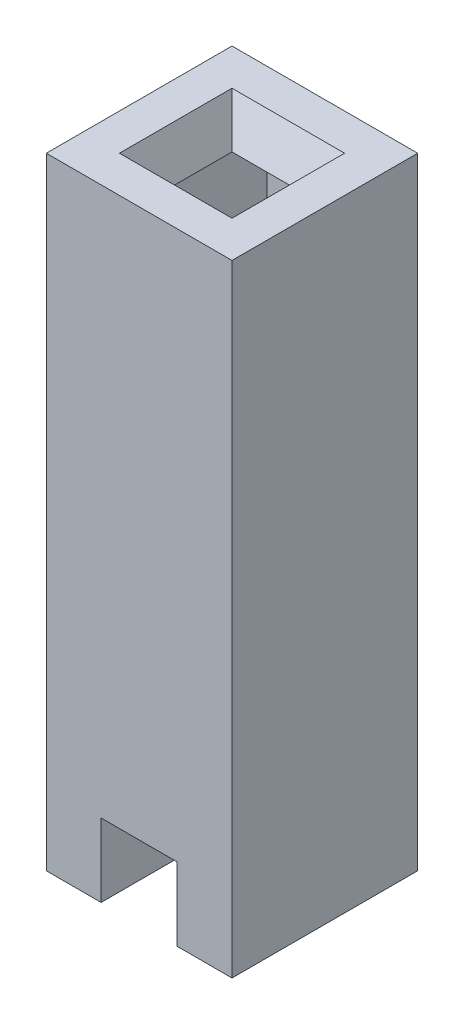
ISO-10303-21;
HEADER;
FILE_DESCRIPTION(('STEP AP214'),'2;1');
FILE_NAME('part.step','',(''),(''),'','','');
FILE_SCHEMA(('AUTOMOTIVE_DESIGN { 1 0 10303 214 1 1 1 1 }'));
ENDSEC;
DATA;
#1=APPLICATION_CONTEXT('core data for automotive mechanical design processes');
#2=APPLICATION_PROTOCOL_DEFINITION('international standard','automotive_design',2000,#1);
#3=PRODUCT_CONTEXT('',#1,'mechanical');
#4=PRODUCT('Part','Part','',(#3));
#5=PRODUCT_RELATED_PRODUCT_CATEGORY('part','',(#4));
#6=PRODUCT_DEFINITION_FORMATION('','',#4);
#7=PRODUCT_DEFINITION_CONTEXT('part definition',#1,'design');
#8=PRODUCT_DEFINITION('design','',#6,#7);
#9=PRODUCT_DEFINITION_SHAPE('','',#8);
#10=(LENGTH_UNIT() NAMED_UNIT(*) SI_UNIT(.MILLI.,.METRE.));
#11=(NAMED_UNIT(*) PLANE_ANGLE_UNIT() SI_UNIT($,.RADIAN.));
#12=(NAMED_UNIT(*) SI_UNIT($,.STERADIAN.) SOLID_ANGLE_UNIT());
#13=UNCERTAINTY_MEASURE_WITH_UNIT(LENGTH_MEASURE(1.E-05),#10,'distance_accuracy_value','');
#14=(GEOMETRIC_REPRESENTATION_CONTEXT(3) GLOBAL_UNCERTAINTY_ASSIGNED_CONTEXT((#13)) GLOBAL_UNIT_ASSIGNED_CONTEXT((#10,
#11,#12)) REPRESENTATION_CONTEXT('',''));
#15=CARTESIAN_POINT('',(0.,0.,0.));
#16=DIRECTION('',(0.,0.,1.));
#17=DIRECTION('',(1.,0.,0.));
#18=AXIS2_PLACEMENT_3D('',#15,#16,#17);
#19=CARTESIAN_POINT('',(-0.75,1.,2.54));
#20=DIRECTION('',(0.,1.,0.));
#21=DIRECTION('',(-1.,0.,0.));
#22=AXIS2_PLACEMENT_3D('',#19,#20,#21);
#23=PLANE('',#22);
#24=DIRECTION('',(0.,0.,-1.));
#25=VECTOR('',#24,1.);
#26=CARTESIAN_POINT('',(-1.79,1.,2.54));
#27=LINE('',#26,#25);
#28=CARTESIAN_POINT('',(-1.79,1.,2.54));
#29=VERTEX_POINT('',#28);
#30=CARTESIAN_POINT('',(-1.79,1.,2.27));
#31=VERTEX_POINT('',#30);
#32=EDGE_CURVE('E300',#29,#31,#27,.T.);
#33=ORIENTED_EDGE('',*,*,#32,.T.);
#34=DIRECTION('',(-1.,0.,0.));
#35=VECTOR('',#34,1.);
#36=CARTESIAN_POINT('',(-1.79,1.,2.27));
#37=LINE('',#36,#35);
#38=CARTESIAN_POINT('',(-0.75,1.,2.27));
#39=VERTEX_POINT('',#38);
#40=EDGE_CURVE('E216',#39,#31,#37,.T.);
#41=ORIENTED_EDGE('',*,*,#40,.F.);
#42=DIRECTION('',(0.,0.,-1.));
#43=VECTOR('',#42,1.);
#44=CARTESIAN_POINT('',(-0.75,1.,2.54));
#45=LINE('',#44,#43);
#46=CARTESIAN_POINT('',(-0.75,1.,2.54));
#47=VERTEX_POINT('',#46);
#48=EDGE_CURVE('E295',#47,#39,#45,.T.);
#49=ORIENTED_EDGE('',*,*,#48,.F.);
#50=DIRECTION('',(1.,0.,0.));
#51=VECTOR('',#50,1.);
#52=CARTESIAN_POINT('',(-0.75,1.,2.54));
#53=LINE('',#52,#51);
#54=EDGE_CURVE('E252',#29,#47,#53,.T.);
#55=ORIENTED_EDGE('',*,*,#54,.F.);
#56=EDGE_LOOP('',(#33,#41,#49,#55));
#57=FACE_BOUND('',#56,.T.);
#58=ADVANCED_FACE('F38',(#57),#23,.F.);
#59=CARTESIAN_POINT('',(0.,0.,2.54));
#60=DIRECTION('',(-1.,0.,0.));
#61=DIRECTION('',(0.,-1.,0.));
#62=AXIS2_PLACEMENT_3D('',#59,#60,#61);
#63=PLANE('',#62);
#64=DIRECTION('',(0.,1.,0.));
#65=VECTOR('',#64,1.);
#66=CARTESIAN_POINT('',(0.,0.,0.));
#67=LINE('',#66,#65);
#68=CARTESIAN_POINT('',(0.,0.,0.));
#69=VERTEX_POINT('',#68);
#70=CARTESIAN_POINT('',(0.,8.5,0.));
#71=VERTEX_POINT('',#70);
#72=EDGE_CURVE('E234',#69,#71,#67,.T.);
#73=ORIENTED_EDGE('',*,*,#72,.T.);
#74=DIRECTION('',(0.,0.,-1.));
#75=VECTOR('',#74,1.);
#76=CARTESIAN_POINT('',(0.,8.5,2.54));
#77=LINE('',#76,#75);
#78=CARTESIAN_POINT('',(0.,8.5,2.54));
#79=VERTEX_POINT('',#78);
#80=EDGE_CURVE('E12',#79,#71,#77,.T.);
#81=ORIENTED_EDGE('',*,*,#80,.F.);
#82=DIRECTION('',(0.,1.,0.));
#83=VECTOR('',#82,1.);
#84=CARTESIAN_POINT('',(0.,0.,2.54));
#85=LINE('',#84,#83);
#86=CARTESIAN_POINT('',(0.,0.,2.54));
#87=VERTEX_POINT('',#86);
#88=EDGE_CURVE('E235',#87,#79,#85,.T.);
#89=ORIENTED_EDGE('',*,*,#88,.F.);
#90=DIRECTION('',(0.,0.,-1.));
#91=VECTOR('',#90,1.);
#92=CARTESIAN_POINT('',(0.,0.,2.54));
#93=LINE('',#92,#91);
#94=EDGE_CURVE('E261',#87,#69,#93,.T.);
#95=ORIENTED_EDGE('',*,*,#94,.T.);
#96=EDGE_LOOP('',(#73,#81,#89,#95));
#97=FACE_BOUND('',#96,.T.);
#98=ADVANCED_FACE('F40',(#97),#63,.F.);
#99=CARTESIAN_POINT('',(0.,8.5,2.54));
#100=DIRECTION('',(0.,-1.,0.));
#101=DIRECTION('',(0.,0.,-1.));
#102=AXIS2_PLACEMENT_3D('',#99,#100,#101);
#103=PLANE('',#102);
#104=DIRECTION('',(-1.,0.,0.));
#105=VECTOR('',#104,1.);
#106=CARTESIAN_POINT('',(-0.5,8.5,0.5));
#107=LINE('',#106,#105);
#108=CARTESIAN_POINT('',(-0.5,8.5,0.5));
#109=VERTEX_POINT('',#108);
#110=CARTESIAN_POINT('',(-2.04,8.5,0.5));
#111=VERTEX_POINT('',#110);
#112=EDGE_CURVE('E177',#109,#111,#107,.T.);
#113=ORIENTED_EDGE('',*,*,#112,.F.);
#114=DIRECTION('',(0.,0.,-1.));
#115=VECTOR('',#114,1.);
#116=CARTESIAN_POINT('',(-0.5,8.5,2.04));
#117=LINE('',#116,#115);
#118=CARTESIAN_POINT('',(-0.5,8.5,2.04));
#119=VERTEX_POINT('',#118);
#120=EDGE_CURVE('E54',#119,#109,#117,.T.);
#121=ORIENTED_EDGE('',*,*,#120,.F.);
#122=DIRECTION('',(1.,0.,0.));
#123=VECTOR('',#122,1.);
#124=CARTESIAN_POINT('',(-2.04,8.5,2.04));
#125=LINE('',#124,#123);
#126=CARTESIAN_POINT('',(-2.04,8.5,2.04));
#127=VERTEX_POINT('',#126);
#128=EDGE_CURVE('E163',#127,#119,#125,.T.);
#129=ORIENTED_EDGE('',*,*,#128,.F.);
#130=DIRECTION('',(0.,0.,1.));
#131=VECTOR('',#130,1.);
#132=CARTESIAN_POINT('',(-2.04,8.5,0.5));
#133=LINE('',#132,#131);
#134=EDGE_CURVE('E172',#111,#127,#133,.T.);
#135=ORIENTED_EDGE('',*,*,#134,.F.);
#136=EDGE_LOOP('',(#113,#121,#129,#135));
#137=FACE_BOUND('',#136,.T.);
#138=DIRECTION('',(-1.,0.,0.));
#139=VECTOR('',#138,1.);
#140=CARTESIAN_POINT('',(0.,8.5,0.));
#141=LINE('',#140,#139);
#142=CARTESIAN_POINT('',(-2.54,8.5,0.));
#143=VERTEX_POINT('',#142);
#144=EDGE_CURVE('E265',#71,#143,#141,.T.);
#145=ORIENTED_EDGE('',*,*,#144,.T.);
#146=DIRECTION('',(0.,0.,-1.));
#147=VECTOR('',#146,1.);
#148=CARTESIAN_POINT('',(-2.54,8.5,2.54));
#149=LINE('',#148,#147);
#150=CARTESIAN_POINT('',(-2.54,8.5,2.54));
#151=VERTEX_POINT('',#150);
#152=EDGE_CURVE('E47',#151,#143,#149,.T.);
#153=ORIENTED_EDGE('',*,*,#152,.F.);
#154=DIRECTION('',(-1.,0.,0.));
#155=VECTOR('',#154,1.);
#156=CARTESIAN_POINT('',(0.,8.5,2.54));
#157=LINE('',#156,#155);
#158=EDGE_CURVE('E239',#79,#151,#157,.T.);
#159=ORIENTED_EDGE('',*,*,#158,.F.);
#160=ORIENTED_EDGE('',*,*,#80,.T.);
#161=EDGE_LOOP('',(#145,#153,#159,#160));
#162=FACE_BOUND('',#161,.T.);
#163=ADVANCED_FACE('F175',(#137,#162),#103,.F.);
#164=CARTESIAN_POINT('',(-2.54,0.,2.54));
#165=DIRECTION('',(1.,0.,0.));
#166=DIRECTION('',(0.,0.,-1.));
#167=AXIS2_PLACEMENT_3D('',#164,#165,#166);
#168=PLANE('',#167);
#169=DIRECTION('',(0.,-1.,0.));
#170=VECTOR('',#169,1.);
#171=CARTESIAN_POINT('',(-2.54,0.,0.));
#172=LINE('',#171,#170);
#173=CARTESIAN_POINT('',(-2.54,0.,0.));
#174=VERTEX_POINT('',#173);
#175=EDGE_CURVE('E268',#143,#174,#172,.T.);
#176=ORIENTED_EDGE('',*,*,#175,.T.);
#177=DIRECTION('',(0.,0.,-1.));
#178=VECTOR('',#177,1.);
#179=CARTESIAN_POINT('',(-2.54,0.,2.54));
#180=LINE('',#179,#178);
#181=CARTESIAN_POINT('',(-2.54,0.,2.54));
#182=VERTEX_POINT('',#181);
#183=EDGE_CURVE('E308',#182,#174,#180,.T.);
#184=ORIENTED_EDGE('',*,*,#183,.F.);
#185=DIRECTION('',(0.,-1.,0.));
#186=VECTOR('',#185,1.);
#187=CARTESIAN_POINT('',(-2.54,0.,2.54));
#188=LINE('',#187,#186);
#189=EDGE_CURVE('E243',#151,#182,#188,.T.);
#190=ORIENTED_EDGE('',*,*,#189,.F.);
#191=ORIENTED_EDGE('',*,*,#152,.T.);
#192=EDGE_LOOP('',(#176,#184,#190,#191));
#193=FACE_BOUND('',#192,.T.);
#194=ADVANCED_FACE('F317',(#193),#168,.F.);
#195=CARTESIAN_POINT('',(-1.79,0.,2.54));
#196=DIRECTION('',(0.,1.,0.));
#197=DIRECTION('',(-1.,0.,0.));
#198=AXIS2_PLACEMENT_3D('',#195,#196,#197);
#199=PLANE('',#198);
#200=DIRECTION('',(1.,0.,0.));
#201=VECTOR('',#200,1.);
#202=CARTESIAN_POINT('',(-1.79,0.,0.));
#203=LINE('',#202,#201);
#204=CARTESIAN_POINT('',(-1.79,0.,0.));
#205=VERTEX_POINT('',#204);
#206=EDGE_CURVE('E271',#174,#205,#203,.T.);
#207=ORIENTED_EDGE('',*,*,#206,.T.);
#208=DIRECTION('',(0.,0.,-1.));
#209=VECTOR('',#208,1.);
#210=CARTESIAN_POINT('',(-1.79,0.,2.54));
#211=LINE('',#210,#209);
#212=CARTESIAN_POINT('',(-1.79,0.,2.54));
#213=VERTEX_POINT('',#212);
#214=EDGE_CURVE('E304',#213,#205,#211,.T.);
#215=ORIENTED_EDGE('',*,*,#214,.F.);
#216=DIRECTION('',(1.,0.,0.));
#217=VECTOR('',#216,1.);
#218=CARTESIAN_POINT('',(-1.79,0.,2.54));
#219=LINE('',#218,#217);
#220=EDGE_CURVE('E246',#182,#213,#219,.T.);
#221=ORIENTED_EDGE('',*,*,#220,.F.);
#222=ORIENTED_EDGE('',*,*,#183,.T.);
#223=EDGE_LOOP('',(#207,#215,#221,#222));
#224=FACE_BOUND('',#223,.T.);
#225=ADVANCED_FACE('F327',(#224),#199,.F.);
#226=CARTESIAN_POINT('',(-1.79,0.,2.54));
#227=DIRECTION('',(-1.,0.,0.));
#228=DIRECTION('',(0.,0.,1.));
#229=AXIS2_PLACEMENT_3D('',#226,#227,#228);
#230=PLANE('',#229);
#231=DIRECTION('',(0.,1.,0.));
#232=VECTOR('',#231,1.);
#233=CARTESIAN_POINT('',(-1.79,0.,0.));
#234=LINE('',#233,#232);
#235=CARTESIAN_POINT('',(-1.79,1.,0.));
#236=VERTEX_POINT('',#235);
#237=EDGE_CURVE('E274',#205,#236,#234,.T.);
#238=ORIENTED_EDGE('',*,*,#237,.T.);
#239=CARTESIAN_POINT('',(-1.79,1.,0.27));
#240=VERTEX_POINT('',#239);
#241=EDGE_CURVE('E299',#240,#236,#27,.T.);
#242=ORIENTED_EDGE('',*,*,#241,.F.);
#243=DIRECTION('',(0.,-1.,0.));
#244=VECTOR('',#243,1.);
#245=CARTESIAN_POINT('',(-1.79,10.7542404485769,0.27));
#246=LINE('',#245,#244);
#247=CARTESIAN_POINT('',(-1.79,8.,0.27));
#248=VERTEX_POINT('',#247);
#249=EDGE_CURVE('E220',#248,#240,#246,.T.);
#250=ORIENTED_EDGE('',*,*,#249,.F.);
#251=DIRECTION('',(0.,0.,1.));
#252=VECTOR('',#251,1.);
#253=CARTESIAN_POINT('',(-1.79,8.,2.27));
#254=LINE('',#253,#252);
#255=CARTESIAN_POINT('',(-1.79,8.,2.27));
#256=VERTEX_POINT('',#255);
#257=EDGE_CURVE('E210',#248,#256,#254,.T.);
#258=ORIENTED_EDGE('',*,*,#257,.T.);
#259=DIRECTION('',(0.,-1.,0.));
#260=VECTOR('',#259,1.);
#261=CARTESIAN_POINT('',(-1.79,10.7542404485769,2.27));
#262=LINE('',#261,#260);
#263=EDGE_CURVE('E207',#256,#31,#262,.T.);
#264=ORIENTED_EDGE('',*,*,#263,.T.);
#265=ORIENTED_EDGE('',*,*,#32,.F.);
#266=DIRECTION('',(0.,1.,0.));
#267=VECTOR('',#266,1.);
#268=CARTESIAN_POINT('',(-1.79,0.,2.54));
#269=LINE('',#268,#267);
#270=EDGE_CURVE('E249',#213,#29,#269,.T.);
#271=ORIENTED_EDGE('',*,*,#270,.F.);
#272=ORIENTED_EDGE('',*,*,#214,.T.);
#273=EDGE_LOOP('',(#238,#242,#250,#258,#264,#265,#271,#272));
#274=FACE_BOUND('',#273,.T.);
#275=ADVANCED_FACE('F331',(#274),#230,.F.);
#276=CARTESIAN_POINT('',(-0.75,1.,0.27));
#277=VERTEX_POINT('',#276);
#278=CARTESIAN_POINT('',(-0.75,1.,0.));
#279=VERTEX_POINT('',#278);
#280=EDGE_CURVE('E294',#277,#279,#45,.T.);
#281=ORIENTED_EDGE('',*,*,#280,.F.);
#282=DIRECTION('',(1.,0.,0.));
#283=VECTOR('',#282,1.);
#284=CARTESIAN_POINT('',(-1.79,1.,0.27));
#285=LINE('',#284,#283);
#286=EDGE_CURVE('E171',#240,#277,#285,.T.);
#287=ORIENTED_EDGE('',*,*,#286,.F.);
#288=ORIENTED_EDGE('',*,*,#241,.T.);
#289=DIRECTION('',(1.,0.,0.));
#290=VECTOR('',#289,1.);
#291=CARTESIAN_POINT('',(-0.75,1.,0.));
#292=LINE('',#291,#290);
#293=EDGE_CURVE('E278',#236,#279,#292,.T.);
#294=ORIENTED_EDGE('',*,*,#293,.T.);
#295=EDGE_LOOP('',(#281,#287,#288,#294));
#296=FACE_BOUND('',#295,.T.);
#297=ADVANCED_FACE('F356',(#296),#23,.F.);
#298=CARTESIAN_POINT('',(-0.75,0.,2.54));
#299=DIRECTION('',(1.,0.,0.));
#300=DIRECTION('',(0.,0.,-1.));
#301=AXIS2_PLACEMENT_3D('',#298,#299,#300);
#302=PLANE('',#301);
#303=DIRECTION('',(0.,-1.,0.));
#304=VECTOR('',#303,1.);
#305=CARTESIAN_POINT('',(-0.75,0.,0.));
#306=LINE('',#305,#304);
#307=CARTESIAN_POINT('',(-0.75,0.,0.));
#308=VERTEX_POINT('',#307);
#309=EDGE_CURVE('E282',#279,#308,#306,.T.);
#310=ORIENTED_EDGE('',*,*,#309,.T.);
#311=DIRECTION('',(0.,0.,-1.));
#312=VECTOR('',#311,1.);
#313=CARTESIAN_POINT('',(-0.75,0.,2.54));
#314=LINE('',#313,#312);
#315=CARTESIAN_POINT('',(-0.75,0.,2.54));
#316=VERTEX_POINT('',#315);
#317=EDGE_CURVE('E290',#316,#308,#314,.T.);
#318=ORIENTED_EDGE('',*,*,#317,.F.);
#319=DIRECTION('',(0.,-1.,0.));
#320=VECTOR('',#319,1.);
#321=CARTESIAN_POINT('',(-0.75,0.,2.54));
#322=LINE('',#321,#320);
#323=EDGE_CURVE('E255',#47,#316,#322,.T.);
#324=ORIENTED_EDGE('',*,*,#323,.F.);
#325=ORIENTED_EDGE('',*,*,#48,.T.);
#326=DIRECTION('',(0.,-1.,0.));
#327=VECTOR('',#326,1.);
#328=CARTESIAN_POINT('',(-0.750000000000002,10.7542404485769,2.27));
#329=LINE('',#328,#327);
#330=CARTESIAN_POINT('',(-0.750000000000002,8.,2.27));
#331=VERTEX_POINT('',#330);
#332=EDGE_CURVE('E223',#331,#39,#329,.T.);
#333=ORIENTED_EDGE('',*,*,#332,.F.);
#334=DIRECTION('',(0.,0.,-1.));
#335=VECTOR('',#334,1.);
#336=CARTESIAN_POINT('',(-0.750000000000002,8.,2.27));
#337=LINE('',#336,#335);
#338=CARTESIAN_POINT('',(-0.750000000000002,8.,0.27));
#339=VERTEX_POINT('',#338);
#340=EDGE_CURVE('E203',#331,#339,#337,.T.);
#341=ORIENTED_EDGE('',*,*,#340,.T.);
#342=DIRECTION('',(0.,-1.,0.));
#343=VECTOR('',#342,1.);
#344=CARTESIAN_POINT('',(-0.750000000000002,10.7542404485769,0.27));
#345=LINE('',#344,#343);
#346=EDGE_CURVE('E226',#339,#277,#345,.T.);
#347=ORIENTED_EDGE('',*,*,#346,.T.);
#348=ORIENTED_EDGE('',*,*,#280,.T.);
#349=EDGE_LOOP('',(#310,#318,#324,#325,#333,#341,#347,#348));
#350=FACE_BOUND('',#349,.T.);
#351=ADVANCED_FACE('F350',(#350),#302,.F.);
#352=CARTESIAN_POINT('',(0.,0.,2.54));
#353=DIRECTION('',(0.,1.,0.));
#354=DIRECTION('',(-1.,0.,0.));
#355=AXIS2_PLACEMENT_3D('',#352,#353,#354);
#356=PLANE('',#355);
#357=DIRECTION('',(1.,0.,0.));
#358=VECTOR('',#357,1.);
#359=CARTESIAN_POINT('',(0.,0.,0.));
#360=LINE('',#359,#358);
#361=EDGE_CURVE('E240',#308,#69,#360,.T.);
#362=ORIENTED_EDGE('',*,*,#361,.T.);
#363=ORIENTED_EDGE('',*,*,#94,.F.);
#364=DIRECTION('',(1.,0.,0.));
#365=VECTOR('',#364,1.);
#366=CARTESIAN_POINT('',(0.,0.,2.54));
#367=LINE('',#366,#365);
#368=EDGE_CURVE('E258',#316,#87,#367,.T.);
#369=ORIENTED_EDGE('',*,*,#368,.F.);
#370=ORIENTED_EDGE('',*,*,#317,.T.);
#371=EDGE_LOOP('',(#362,#363,#369,#370));
#372=FACE_BOUND('',#371,.T.);
#373=ADVANCED_FACE('F345',(#372),#356,.F.);
#374=CARTESIAN_POINT('',(0.,0.,2.54));
#375=DIRECTION('',(0.,0.,1.));
#376=DIRECTION('',(1.,0.,0.));
#377=AXIS2_PLACEMENT_3D('',#374,#375,#376);
#378=PLANE('',#377);
#379=ORIENTED_EDGE('',*,*,#88,.T.);
#380=ORIENTED_EDGE('',*,*,#158,.T.);
#381=ORIENTED_EDGE('',*,*,#189,.T.);
#382=ORIENTED_EDGE('',*,*,#220,.T.);
#383=ORIENTED_EDGE('',*,*,#270,.T.);
#384=ORIENTED_EDGE('',*,*,#54,.T.);
#385=ORIENTED_EDGE('',*,*,#323,.T.);
#386=ORIENTED_EDGE('',*,*,#368,.T.);
#387=EDGE_LOOP('',(#379,#380,#381,#382,#383,#384,#385,#386));
#388=FACE_BOUND('',#387,.T.);
#389=ADVANCED_FACE('F336',(#388),#378,.T.);
#390=CARTESIAN_POINT('',(0.,0.,0.));
#391=DIRECTION('',(0.,0.,1.));
#392=DIRECTION('',(1.,0.,0.));
#393=AXIS2_PLACEMENT_3D('',#390,#391,#392);
#394=PLANE('',#393);
#395=ORIENTED_EDGE('',*,*,#72,.F.);
#396=ORIENTED_EDGE('',*,*,#361,.F.);
#397=ORIENTED_EDGE('',*,*,#309,.F.);
#398=ORIENTED_EDGE('',*,*,#293,.F.);
#399=ORIENTED_EDGE('',*,*,#237,.F.);
#400=ORIENTED_EDGE('',*,*,#206,.F.);
#401=ORIENTED_EDGE('',*,*,#175,.F.);
#402=ORIENTED_EDGE('',*,*,#144,.F.);
#403=EDGE_LOOP('',(#395,#396,#397,#398,#399,#400,#401,#402));
#404=FACE_BOUND('',#403,.T.);
#405=ADVANCED_FACE('F322',(#404),#394,.F.);
#406=CARTESIAN_POINT('',(-1.79,10.7542404485769,2.27));
#407=DIRECTION('',(0.,0.,1.));
#408=DIRECTION('',(1.,0.,0.));
#409=AXIS2_PLACEMENT_3D('',#406,#407,#408);
#410=PLANE('',#409);
#411=DIRECTION('',(1.,0.,0.));
#412=VECTOR('',#411,1.);
#413=CARTESIAN_POINT('',(-1.79,8.,2.27));
#414=LINE('',#413,#412);
#415=EDGE_CURVE('E206',#256,#331,#414,.T.);
#416=ORIENTED_EDGE('',*,*,#415,.T.);
#417=ORIENTED_EDGE('',*,*,#332,.T.);
#418=ORIENTED_EDGE('',*,*,#40,.T.);
#419=ORIENTED_EDGE('',*,*,#263,.F.);
#420=EDGE_LOOP('',(#416,#417,#418,#419));
#421=FACE_BOUND('',#420,.T.);
#422=ADVANCED_FACE('F370',(#421),#410,.F.);
#423=CARTESIAN_POINT('',(-1.79,10.7542404485769,0.27));
#424=DIRECTION('',(0.,0.,-1.));
#425=DIRECTION('',(-1.,0.,0.));
#426=AXIS2_PLACEMENT_3D('',#423,#424,#425);
#427=PLANE('',#426);
#428=DIRECTION('',(-1.,0.,0.));
#429=VECTOR('',#428,1.);
#430=CARTESIAN_POINT('',(-1.79,8.,0.27));
#431=LINE('',#430,#429);
#432=EDGE_CURVE('E213',#339,#248,#431,.T.);
#433=ORIENTED_EDGE('',*,*,#432,.T.);
#434=ORIENTED_EDGE('',*,*,#249,.T.);
#435=ORIENTED_EDGE('',*,*,#286,.T.);
#436=ORIENTED_EDGE('',*,*,#346,.F.);
#437=EDGE_LOOP('',(#433,#434,#435,#436));
#438=FACE_BOUND('',#437,.T.);
#439=ADVANCED_FACE('F362',(#438),#427,.F.);
#440=CARTESIAN_POINT('',(0.,8.,2.54));
#441=DIRECTION('',(0.,-1.,0.));
#442=DIRECTION('',(0.,0.,-1.));
#443=AXIS2_PLACEMENT_3D('',#440,#441,#442);
#444=PLANE('',#443);
#445=DIRECTION('',(0.,0.,-1.));
#446=VECTOR('',#445,1.);
#447=CARTESIAN_POINT('',(-0.754762724747216,8.,2.04));
#448=LINE('',#447,#446);
#449=CARTESIAN_POINT('',(-0.754762724747216,8.,1.78523727525278));
#450=VERTEX_POINT('',#449);
#451=CARTESIAN_POINT('',(-0.754762724747216,8.,0.754762724747215));
#452=VERTEX_POINT('',#451);
#453=EDGE_CURVE('E155',#450,#452,#448,.T.);
#454=ORIENTED_EDGE('',*,*,#453,.T.);
#455=DIRECTION('',(-1.,0.,0.));
#456=VECTOR('',#455,1.);
#457=CARTESIAN_POINT('',(-0.5,8.,0.754762724747215));
#458=LINE('',#457,#456);
#459=CARTESIAN_POINT('',(-1.78523727525278,8.,0.754762724747215));
#460=VERTEX_POINT('',#459);
#461=EDGE_CURVE('E185',#452,#460,#458,.T.);
#462=ORIENTED_EDGE('',*,*,#461,.T.);
#463=DIRECTION('',(0.,0.,1.));
#464=VECTOR('',#463,1.);
#465=CARTESIAN_POINT('',(-1.78523727525279,8.,0.5));
#466=LINE('',#465,#464);
#467=CARTESIAN_POINT('',(-1.78523727525279,8.,1.78523727525278));
#468=VERTEX_POINT('',#467);
#469=EDGE_CURVE('E159',#460,#468,#466,.T.);
#470=ORIENTED_EDGE('',*,*,#469,.T.);
#471=DIRECTION('',(1.,0.,0.));
#472=VECTOR('',#471,1.);
#473=CARTESIAN_POINT('',(-2.04,8.,1.78523727525278));
#474=LINE('',#473,#472);
#475=EDGE_CURVE('E160',#468,#450,#474,.T.);
#476=ORIENTED_EDGE('',*,*,#475,.T.);
#477=EDGE_LOOP('',(#454,#462,#470,#476));
#478=FACE_BOUND('',#477,.T.);
#479=ORIENTED_EDGE('',*,*,#257,.F.);
#480=ORIENTED_EDGE('',*,*,#432,.F.);
#481=ORIENTED_EDGE('',*,*,#340,.F.);
#482=ORIENTED_EDGE('',*,*,#415,.F.);
#483=EDGE_LOOP('',(#479,#480,#481,#482));
#484=FACE_BOUND('',#483,.T.);
#485=ADVANCED_FACE('F366',(#478,#484),#444,.T.);
#486=CARTESIAN_POINT('',(-0.5,8.5,2.04));
#487=DIRECTION('',(0.891006524188367,-0.453990499739548,0.));
#488=DIRECTION('',(0.453990499739548,0.891006524188367,0.));
#489=AXIS2_PLACEMENT_3D('',#486,#487,#488);
#490=PLANE('',#489);
#491=DIRECTION('',(0.413384109704205,0.811311996514364,0.413384109704205));
#492=VECTOR('',#491,1.);
#493=CARTESIAN_POINT('',(-0.763165090120145,7.983509429448,1.77683490987986));
#494=LINE('',#493,#492);
#495=EDGE_CURVE('E151',#450,#119,#494,.T.);
#496=ORIENTED_EDGE('',*,*,#495,.T.);
#497=ORIENTED_EDGE('',*,*,#120,.T.);
#498=DIRECTION('',(0.413384109704205,0.811311996514364,-0.413384109704205));
#499=VECTOR('',#498,1.);
#500=CARTESIAN_POINT('',(-0.763165090120145,7.983509429448,0.763165090120145));
#501=LINE('',#500,#499);
#502=EDGE_CURVE('E193',#452,#109,#501,.T.);
#503=ORIENTED_EDGE('',*,*,#502,.F.);
#504=ORIENTED_EDGE('',*,*,#453,.F.);
#505=EDGE_LOOP('',(#496,#497,#503,#504));
#506=FACE_BOUND('',#505,.T.);
#507=ADVANCED_FACE('F153',(#506),#490,.F.);
#508=CARTESIAN_POINT('',(-2.04,8.5,2.04));
#509=DIRECTION('',(0.,-0.453990499739548,0.891006524188367));
#510=DIRECTION('',(0.,-0.891006524188367,-0.453990499739548));
#511=AXIS2_PLACEMENT_3D('',#508,#509,#510);
#512=PLANE('',#511);
#513=DIRECTION('',(-0.413384109704205,0.811311996514364,0.413384109704205));
#514=VECTOR('',#513,1.);
#515=CARTESIAN_POINT('',(-1.77683490987986,7.983509429448,1.77683490987986));
#516=LINE('',#515,#514);
#517=EDGE_CURVE('E166',#468,#127,#516,.T.);
#518=ORIENTED_EDGE('',*,*,#517,.T.);
#519=ORIENTED_EDGE('',*,*,#128,.T.);
#520=ORIENTED_EDGE('',*,*,#495,.F.);
#521=ORIENTED_EDGE('',*,*,#475,.F.);
#522=EDGE_LOOP('',(#518,#519,#520,#521));
#523=FACE_BOUND('',#522,.T.);
#524=ADVANCED_FACE('F164',(#523),#512,.F.);
#525=CARTESIAN_POINT('',(-2.04,8.5,0.5));
#526=DIRECTION('',(-0.891006524188367,-0.453990499739548,0.));
#527=DIRECTION('',(0.453990499739548,-0.891006524188367,0.));
#528=AXIS2_PLACEMENT_3D('',#525,#526,#527);
#529=PLANE('',#528);
#530=DIRECTION('',(-0.413384109704205,0.811311996514364,-0.413384109704205));
#531=VECTOR('',#530,1.);
#532=CARTESIAN_POINT('',(-1.77683490987986,7.983509429448,0.763165090120145));
#533=LINE('',#532,#531);
#534=EDGE_CURVE('E62',#460,#111,#533,.T.);
#535=ORIENTED_EDGE('',*,*,#534,.T.);
#536=ORIENTED_EDGE('',*,*,#134,.T.);
#537=ORIENTED_EDGE('',*,*,#517,.F.);
#538=ORIENTED_EDGE('',*,*,#469,.F.);
#539=EDGE_LOOP('',(#535,#536,#537,#538));
#540=FACE_BOUND('',#539,.T.);
#541=ADVANCED_FACE('F471',(#540),#529,.F.);
#542=CARTESIAN_POINT('',(-0.5,8.5,0.5));
#543=DIRECTION('',(0.,-0.453990499739548,-0.891006524188367));
#544=DIRECTION('',(0.,0.891006524188367,-0.453990499739548));
#545=AXIS2_PLACEMENT_3D('',#542,#543,#544);
#546=PLANE('',#545);
#547=ORIENTED_EDGE('',*,*,#502,.T.);
#548=ORIENTED_EDGE('',*,*,#112,.T.);
#549=ORIENTED_EDGE('',*,*,#534,.F.);
#550=ORIENTED_EDGE('',*,*,#461,.F.);
#551=EDGE_LOOP('',(#547,#548,#549,#550));
#552=FACE_BOUND('',#551,.T.);
#553=ADVANCED_FACE('F479',(#552),#546,.F.);
#554=CLOSED_SHELL('',(#58,#98,#163,#194,#225,#275,#297,#351,#373,#389,#405,#422,#439,#485,#507,
#524,#541,#553));
#555=MANIFOLD_SOLID_BREP('B2',#554);
#556=ADVANCED_BREP_SHAPE_REPRESENTATION('',(#18,#555),#14);
#557=SHAPE_DEFINITION_REPRESENTATION(#9,#556);
ENDSEC;
END-ISO-10303-21;
